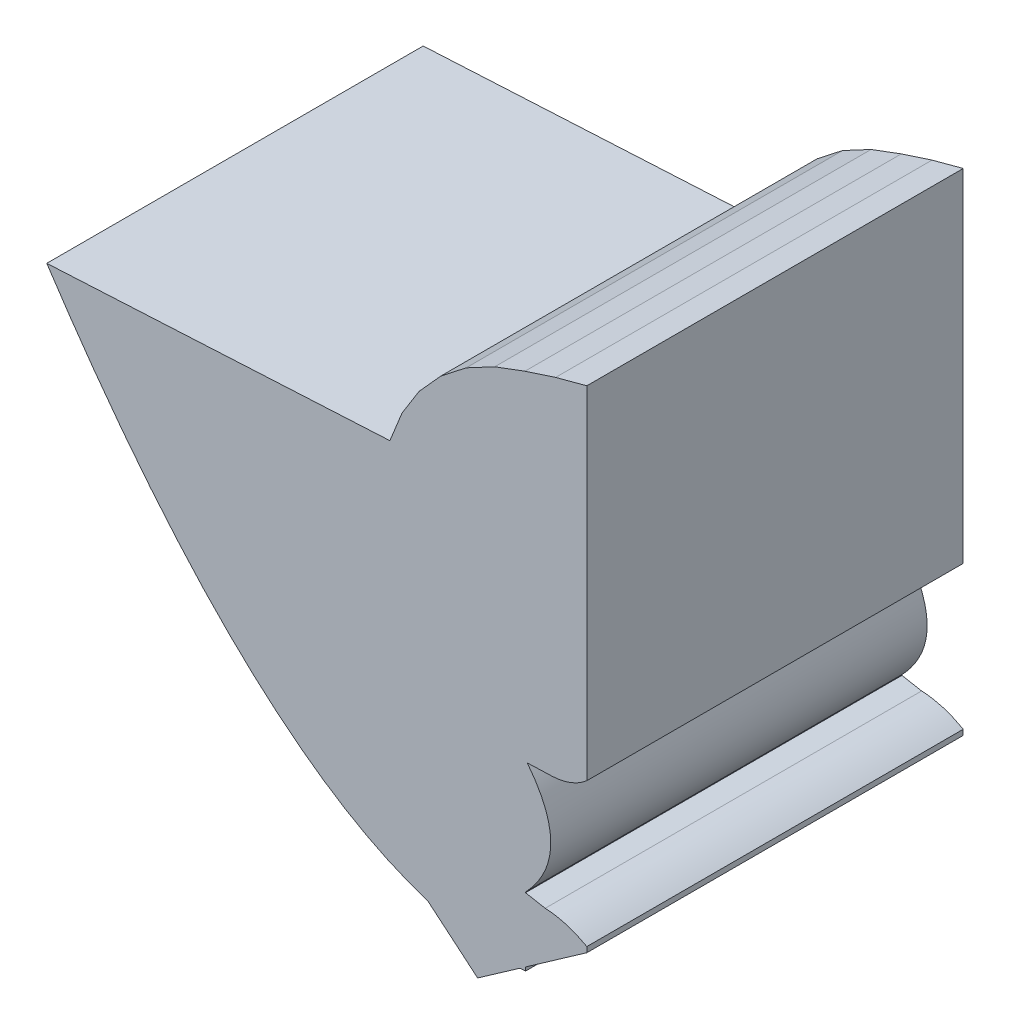
ISO-10303-21;
HEADER;
FILE_DESCRIPTION(('STEP AP214'),'2;1');
FILE_NAME('part.step','',(''),(''),'','','');
FILE_SCHEMA(('AUTOMOTIVE_DESIGN { 1 0 10303 214 1 1 1 1 }'));
ENDSEC;
DATA;
#1=APPLICATION_CONTEXT('core data for automotive mechanical design processes');
#2=APPLICATION_PROTOCOL_DEFINITION('international standard','automotive_design',2000,#1);
#3=PRODUCT_CONTEXT('',#1,'mechanical');
#4=PRODUCT('Part','Part','',(#3));
#5=PRODUCT_RELATED_PRODUCT_CATEGORY('part','',(#4));
#6=PRODUCT_DEFINITION_FORMATION('','',#4);
#7=PRODUCT_DEFINITION_CONTEXT('part definition',#1,'design');
#8=PRODUCT_DEFINITION('design','',#6,#7);
#9=PRODUCT_DEFINITION_SHAPE('','',#8);
#10=(LENGTH_UNIT() NAMED_UNIT(*) SI_UNIT(.MILLI.,.METRE.));
#11=(NAMED_UNIT(*) PLANE_ANGLE_UNIT() SI_UNIT($,.RADIAN.));
#12=(NAMED_UNIT(*) SI_UNIT($,.STERADIAN.) SOLID_ANGLE_UNIT());
#13=UNCERTAINTY_MEASURE_WITH_UNIT(LENGTH_MEASURE(1.E-05),#10,'distance_accuracy_value','');
#14=(GEOMETRIC_REPRESENTATION_CONTEXT(3) GLOBAL_UNCERTAINTY_ASSIGNED_CONTEXT((#13)) GLOBAL_UNIT_ASSIGNED_CONTEXT((#10,
#11,#12)) REPRESENTATION_CONTEXT('',''));
#15=CARTESIAN_POINT('',(0.,0.,0.));
#16=DIRECTION('',(0.,0.,1.));
#17=DIRECTION('',(1.,0.,0.));
#18=AXIS2_PLACEMENT_3D('',#15,#16,#17);
#19=CARTESIAN_POINT('',(-2.17733041778456,0.,6.9937));
#20=DIRECTION('',(1.,0.,0.));
#21=DIRECTION('',(0.,1.,0.));
#22=AXIS2_PLACEMENT_3D('',#19,#20,#21);
#23=PLANE('',#22);
#24=DIRECTION('',(0.,-1.,0.));
#25=VECTOR('',#24,1.);
#26=CARTESIAN_POINT('',(-2.17733041778456,0.,6.9937));
#27=LINE('',#26,#25);
#28=CARTESIAN_POINT('',(-2.17733041778884,-1.84042057231271,6.9937));
#29=VERTEX_POINT('',#28);
#30=CARTESIAN_POINT('',(-2.17733041778456,-1.86563836372951,6.9937));
#31=VERTEX_POINT('',#30);
#32=EDGE_CURVE('E396',#29,#31,#27,.T.);
#33=ORIENTED_EDGE('',*,*,#32,.T.);
#34=DIRECTION('',(0.,0.,-1.));
#35=VECTOR('',#34,1.);
#36=CARTESIAN_POINT('',(-2.17733041778456,-1.86563836372951,6.9937));
#37=LINE('',#36,#35);
#38=CARTESIAN_POINT('',(-2.17733041778456,-1.86563836372951,-6.9937));
#39=VERTEX_POINT('',#38);
#40=EDGE_CURVE('E13',#31,#39,#37,.T.);
#41=ORIENTED_EDGE('',*,*,#40,.T.);
#42=DIRECTION('',(0.,-1.,0.));
#43=VECTOR('',#42,1.);
#44=CARTESIAN_POINT('',(-2.17733041778456,0.,-6.9937));
#45=LINE('',#44,#43);
#46=CARTESIAN_POINT('',(-2.17733041778456,-1.84042057231304,-6.9937));
#47=VERTEX_POINT('',#46);
#48=EDGE_CURVE('E220',#47,#39,#45,.T.);
#49=ORIENTED_EDGE('',*,*,#48,.F.);
#50=DIRECTION('',(0.,0.,-1.));
#51=VECTOR('',#50,1.);
#52=CARTESIAN_POINT('',(-2.17733041778574,-1.84042057231,30.7968303069805));
#53=LINE('',#52,#51);
#54=EDGE_CURVE('E348',#29,#47,#53,.T.);
#55=ORIENTED_EDGE('',*,*,#54,.F.);
#56=EDGE_LOOP('',(#33,#41,#49,#55));
#57=FACE_BOUND('',#56,.T.);
#58=ADVANCED_FACE('F60',(#57),#23,.T.);
#59=CARTESIAN_POINT('',(-2.17733041778456,-4.25341499115567,-6.9937));
#60=VERTEX_POINT('',#59);
#61=CARTESIAN_POINT('',(-2.17733041780011,-4.38828202201252,-6.9937));
#62=VERTEX_POINT('',#61);
#63=EDGE_CURVE('E336',#60,#62,#45,.T.);
#64=ORIENTED_EDGE('',*,*,#63,.F.);
#65=DIRECTION('',(0.,0.,1.));
#66=VECTOR('',#65,1.);
#67=CARTESIAN_POINT('',(-2.17733041778456,-4.25341499115567,6.9937));
#68=LINE('',#67,#66);
#69=CARTESIAN_POINT('',(-2.17733041778456,-4.25341499115567,6.9937));
#70=VERTEX_POINT('',#69);
#71=EDGE_CURVE('E247',#60,#70,#68,.T.);
#72=ORIENTED_EDGE('',*,*,#71,.T.);
#73=CARTESIAN_POINT('',(-2.17733041778456,-4.38828202201252,6.9937));
#74=VERTEX_POINT('',#73);
#75=EDGE_CURVE('E397',#70,#74,#27,.T.);
#76=ORIENTED_EDGE('',*,*,#75,.T.);
#77=DIRECTION('',(0.,0.,1.));
#78=VECTOR('',#77,1.);
#79=CARTESIAN_POINT('',(-2.17733041780011,-4.38828202201252,-6.9937));
#80=LINE('',#79,#78);
#81=EDGE_CURVE('E309',#62,#74,#80,.T.);
#82=ORIENTED_EDGE('',*,*,#81,.F.);
#83=EDGE_LOOP('',(#64,#72,#76,#82));
#84=FACE_BOUND('',#83,.T.);
#85=ADVANCED_FACE('F367',(#84),#23,.T.);
#86=CARTESIAN_POINT('',(-82931.2998220372,996560.090302793,30.7968303069805));
#87=CARTESIAN_POINT('',(87153.689514863,-996199.076380996,30.7968303069805));
#88=CARTESIAN_POINT('',(-91384.2921388703,995820.549302198,30.7968303069805));
#89=B_SPLINE_CURVE_WITH_KNOTS('',2,(#86,#87,#88),.UNSPECIFIED.,.F.,.F.,(3,3),(0.,1.),.UNSPECIFIED.);
#90=DIRECTION('',(0.,0.,-1.));
#91=VECTOR('',#90,1.);
#92=SURFACE_OF_LINEAR_EXTRUSION('',#89,#91);
#93=CARTESIAN_POINT('',(-82931.2998220372,996560.090302793,-6.9937));
#94=CARTESIAN_POINT('',(87153.689514863,-996199.076380996,-6.9937));
#95=CARTESIAN_POINT('',(-91384.2921388703,995820.549302198,-6.9937));
#96=B_SPLINE_CURVE_WITH_KNOTS('',2,(#93,#94,#95),.UNSPECIFIED.,.F.,.F.,(3,3),(0.,1.),.UNSPECIFIED.);
#97=CARTESIAN_POINT('',(-19.9693590135837,9.49376503209609,-6.9937));
#98=VERTEX_POINT('',#97);
#99=CARTESIAN_POINT('',(-5.81761685092486,-3.93929269516321,-6.9937));
#100=VERTEX_POINT('',#99);
#101=EDGE_CURVE('E322',#98,#100,#96,.F.);
#102=ORIENTED_EDGE('',*,*,#101,.T.);
#103=DIRECTION('',(0.,0.,-1.));
#104=VECTOR('',#103,1.);
#105=CARTESIAN_POINT('',(-5.81761685053506,-3.939292695464,0.));
#106=LINE('',#105,#104);
#107=CARTESIAN_POINT('',(-5.81761685092177,-3.93929269516581,6.9937));
#108=VERTEX_POINT('',#107);
#109=EDGE_CURVE('E61',#100,#108,#106,.F.);
#110=ORIENTED_EDGE('',*,*,#109,.T.);
#111=CARTESIAN_POINT('',(-82931.2998220372,996560.090302793,6.9937));
#112=CARTESIAN_POINT('',(87153.689514863,-996199.076380996,6.9937));
#113=CARTESIAN_POINT('',(-91384.2921388703,995820.549302198,6.9937));
#114=B_SPLINE_CURVE_WITH_KNOTS('',2,(#111,#112,#113),.UNSPECIFIED.,.F.,.F.,(3,3),(0.,1.),.UNSPECIFIED.);
#115=CARTESIAN_POINT('',(-19.9693590135837,9.49376503209609,6.9937));
#116=VERTEX_POINT('',#115);
#117=EDGE_CURVE('E339',#108,#116,#114,.T.);
#118=ORIENTED_EDGE('',*,*,#117,.T.);
#119=DIRECTION('',(0.,0.,1.));
#120=VECTOR('',#119,1.);
#121=CARTESIAN_POINT('',(-19.9693590135837,9.49376503209609,-6.9937));
#122=LINE('',#121,#120);
#123=EDGE_CURVE('E307',#98,#116,#122,.T.);
#124=ORIENTED_EDGE('',*,*,#123,.F.);
#125=EDGE_LOOP('',(#102,#110,#118,#124));
#126=FACE_BOUND('',#125,.T.);
#127=ADVANCED_FACE('F364',(#126),#92,.T.);
#128=CARTESIAN_POINT('',(-2.38857363559612,-4.40132908466322,6.9937));
#129=VERTEX_POINT('',#128);
#130=EDGE_CURVE('E330',#74,#129,#114,.T.);
#131=ORIENTED_EDGE('',*,*,#130,.T.);
#132=DIRECTION('',(0.,0.,-1.));
#133=VECTOR('',#132,1.);
#134=CARTESIAN_POINT('',(-2.38857363569212,-4.40132908475959,0.));
#135=LINE('',#134,#133);
#136=CARTESIAN_POINT('',(-2.38857363552891,-4.40132908473014,-6.9937));
#137=VERTEX_POINT('',#136);
#138=EDGE_CURVE('E402',#129,#137,#135,.T.);
#139=ORIENTED_EDGE('',*,*,#138,.T.);
#140=EDGE_CURVE('E318',#137,#62,#96,.F.);
#141=ORIENTED_EDGE('',*,*,#140,.T.);
#142=ORIENTED_EDGE('',*,*,#81,.T.);
#143=EDGE_LOOP('',(#131,#139,#141,#142));
#144=FACE_BOUND('',#143,.T.);
#145=ADVANCED_FACE('F368',(#144),#92,.T.);
#146=CARTESIAN_POINT('',(-996004.99942647,89338.2959789018,30.7968303069805));
#147=CARTESIAN_POINT('',(996193.448091746,-87155.7427476542,30.7968303069805));
#148=CARTESIAN_POINT('',(-996386.896757022,84973.1895164066,30.7968303069805));
#149=B_SPLINE_CURVE_WITH_KNOTS('',2,(#146,#147,#148),.UNSPECIFIED.,.F.,.F.,(3,3),(0.,1.),.UNSPECIFIED.);
#150=DIRECTION('',(0.,0.,-1.));
#151=VECTOR('',#150,1.);
#152=SURFACE_OF_LINEAR_EXTRUSION('',#149,#151);
#153=CARTESIAN_POINT('',(-996004.99942647,89338.2959789018,-6.9937));
#154=CARTESIAN_POINT('',(996193.448091746,-87155.7427476542,-6.9937));
#155=CARTESIAN_POINT('',(-996386.896757022,84973.1895164066,-6.9937));
#156=B_SPLINE_CURVE_WITH_KNOTS('',2,(#153,#154,#155),.UNSPECIFIED.,.F.,.F.,(3,3),(0.,1.),.UNSPECIFIED.);
#157=CARTESIAN_POINT('',(-2.11351559802885,2.3447154697661,-6.9937));
#158=VERTEX_POINT('',#157);
#159=EDGE_CURVE('E312',#47,#158,#156,.F.);
#160=ORIENTED_EDGE('',*,*,#159,.T.);
#161=DIRECTION('',(0.,0.,-1.));
#162=VECTOR('',#161,1.);
#163=CARTESIAN_POINT('',(-2.11351560820955,2.34471546941639,0.));
#164=LINE('',#163,#162);
#165=CARTESIAN_POINT('',(-2.11351559756429,2.34471545593529,6.9937));
#166=VERTEX_POINT('',#165);
#167=EDGE_CURVE('E398',#158,#166,#164,.F.);
#168=ORIENTED_EDGE('',*,*,#167,.T.);
#169=CARTESIAN_POINT('',(-996004.99942647,89338.2959789018,6.9937));
#170=CARTESIAN_POINT('',(996193.448091746,-87155.7427476542,6.9937));
#171=CARTESIAN_POINT('',(-996386.896757022,84973.1895164066,6.9937));
#172=B_SPLINE_CURVE_WITH_KNOTS('',2,(#169,#170,#171),.UNSPECIFIED.,.F.,.F.,(3,3),(0.,1.),.UNSPECIFIED.);
#173=EDGE_CURVE('E328',#166,#29,#172,.T.);
#174=ORIENTED_EDGE('',*,*,#173,.T.);
#175=ORIENTED_EDGE('',*,*,#54,.T.);
#176=EDGE_LOOP('',(#160,#168,#174,#175));
#177=FACE_BOUND('',#176,.T.);
#178=ADVANCED_FACE('F373',(#177),#152,.T.);
#179=CARTESIAN_POINT('',(0.,0.,6.9937));
#180=DIRECTION('',(0.,0.,1.));
#181=DIRECTION('',(1.,0.,0.));
#182=AXIS2_PLACEMENT_3D('',#179,#180,#181);
#183=PLANE('',#182);
#184=ORIENTED_EDGE('',*,*,#75,.F.);
#185=DIRECTION('',(0.819152044288594,0.573576436351615,0.));
#186=VECTOR('',#185,1.);
#187=CARTESIAN_POINT('',(0.100000000004221,-2.65881106562334,6.9937));
#188=LINE('',#187,#186);
#189=CARTESIAN_POINT('',(0.100000000004221,-2.65881106562334,6.9937));
#190=VERTEX_POINT('',#189);
#191=EDGE_CURVE('E71',#70,#190,#188,.T.);
#192=ORIENTED_EDGE('',*,*,#191,.T.);
#193=DIRECTION('',(-1.62011653008151E-11,1.,0.));
#194=VECTOR('',#193,1.);
#195=CARTESIAN_POINT('',(0.100000000000981,-2.45881106562334,6.9937));
#196=LINE('',#195,#194);
#197=CARTESIAN_POINT('',(0.100000000000981,-2.45881106562334,6.9937));
#198=VERTEX_POINT('',#197);
#199=EDGE_CURVE('E257',#190,#198,#196,.T.);
#200=ORIENTED_EDGE('',*,*,#199,.T.);
#201=CARTESIAN_POINT('',(-15004.7897636461,-999892.444646946,6.9937));
#202=CARTESIAN_POINT('',(17450.906437277,999845.695156391,6.9937));
#203=CARTESIAN_POINT('',(-19903.023110908,-999806.945665836,6.9937));
#204=B_SPLINE_CURVE_WITH_KNOTS('',2,(#201,#202,#203),.UNSPECIFIED.,.F.,.F.,(3,3),(0.,1.),.UNSPECIFIED.);
#205=CARTESIAN_POINT('',(-1.44765075676889,-2.00137084805176,6.9937));
#206=VERTEX_POINT('',#205);
#207=EDGE_CURVE('E255',#198,#206,#204,.T.);
#208=ORIENTED_EDGE('',*,*,#207,.T.);
#209=DIRECTION('',(-0.983135348114243,0.182879433748812,0.));
#210=VECTOR('',#209,1.);
#211=CARTESIAN_POINT('',(-1.44765075676889,-2.00137084805176,6.9937));
#212=LINE('',#211,#210);
#213=EDGE_CURVE('E227',#206,#31,#212,.T.);
#214=ORIENTED_EDGE('',*,*,#213,.T.);
#215=ORIENTED_EDGE('',*,*,#32,.F.);
#216=ORIENTED_EDGE('',*,*,#173,.F.);
#217=DIRECTION('',(0.999390827019096,0.0348994967025048,0.));
#218=VECTOR('',#217,1.);
#219=CARTESIAN_POINT('',(-2.17733041778456,2.34248700715526,6.9937));
#220=LINE('',#219,#218);
#221=CARTESIAN_POINT('',(-1.19050164048462,2.37694782742692,6.9937));
#222=VERTEX_POINT('',#221);
#223=EDGE_CURVE('E501',#166,#222,#220,.T.);
#224=ORIENTED_EDGE('',*,*,#223,.T.);
#225=CARTESIAN_POINT('',(-343900.072311573,939011.080499257,6.9937));
#226=CARTESIAN_POINT('',(342019.599581338,-939690.120785908,6.9937));
#227=CARTESIAN_POINT('',(-340141.301828429,940379.16107256,6.9937));
#228=B_SPLINE_CURVE_WITH_KNOTS('',2,(#225,#226,#227),.UNSPECIFIED.,.F.,.F.,(3,3),(0.,1.),.UNSPECIFIED.);
#229=CARTESIAN_POINT('',(0.100000000004221,2.87767341815847,6.9937));
#230=VERTEX_POINT('',#229);
#231=EDGE_CURVE('E306',#222,#230,#228,.T.);
#232=ORIENTED_EDGE('',*,*,#231,.T.);
#233=DIRECTION('',(0.,1.,0.));
#234=VECTOR('',#233,1.);
#235=CARTESIAN_POINT('',(0.100000000004221,2.87767341815847,6.9937));
#236=LINE('',#235,#234);
#237=CARTESIAN_POINT('',(0.100000000004747,15.587903347272,6.9937));
#238=VERTEX_POINT('',#237);
#239=EDGE_CURVE('E433',#230,#238,#236,.T.);
#240=ORIENTED_EDGE('',*,*,#239,.T.);
#241=DIRECTION('',(-0.96592582628907,-0.258819045102515,0.));
#242=VECTOR('',#241,1.);
#243=CARTESIAN_POINT('',(-1.05911099154214,15.277320493149,6.9937));
#244=LINE('',#243,#242);
#245=CARTESIAN_POINT('',(-1.05911099154214,15.277320493149,6.9937));
#246=VERTEX_POINT('',#245);
#247=EDGE_CURVE('E438',#238,#246,#244,.T.);
#248=ORIENTED_EDGE('',*,*,#247,.T.);
#249=DIRECTION('',(-0.951056516295155,-0.309016994374943,0.));
#250=VECTOR('',#249,1.);
#251=CARTESIAN_POINT('',(-2.20037881109632,14.906500099899,6.9937));
#252=LINE('',#251,#250);
#253=CARTESIAN_POINT('',(-2.20037881109632,14.906500099899,6.9937));
#254=VERTEX_POINT('',#253);
#255=EDGE_CURVE('E445',#246,#254,#252,.T.);
#256=ORIENTED_EDGE('',*,*,#255,.T.);
#257=DIRECTION('',(-0.9366721892484,-0.350207381259461,0.));
#258=VECTOR('',#257,1.);
#259=CARTESIAN_POINT('',(-3.3243854381944,14.4862512423877,6.9937));
#260=LINE('',#259,#258);
#261=CARTESIAN_POINT('',(-3.3243854381944,14.4862512423877,6.9937));
#262=VERTEX_POINT('',#261);
#263=EDGE_CURVE('E517',#254,#262,#260,.T.);
#264=ORIENTED_EDGE('',*,*,#263,.T.);
#265=DIRECTION('',(-0.882947592859007,-0.46947156278574,0.));
#266=VECTOR('',#265,1.);
#267=CARTESIAN_POINT('',(-4.38392254962521,13.9228853670448,6.9937));
#268=LINE('',#267,#266);
#269=CARTESIAN_POINT('',(-4.38392254962521,13.9228853670448,6.9937));
#270=VERTEX_POINT('',#269);
#271=EDGE_CURVE('E514',#262,#270,#268,.T.);
#272=ORIENTED_EDGE('',*,*,#271,.T.);
#273=DIRECTION('',(-0.788010753606726,-0.615661475325654,0.));
#274=VECTOR('',#273,1.);
#275=CARTESIAN_POINT('',(-5.32953545395328,13.184091596654,6.9937));
#276=LINE('',#275,#274);
#277=CARTESIAN_POINT('',(-5.32953545395328,13.184091596654,6.9937));
#278=VERTEX_POINT('',#277);
#279=EDGE_CURVE('E509',#270,#278,#276,.T.);
#280=ORIENTED_EDGE('',*,*,#279,.T.);
#281=DIRECTION('',(-0.669130606358526,-0.743144825477694,0.));
#282=VECTOR('',#281,1.);
#283=CARTESIAN_POINT('',(-6.13249218158351,12.2923178060808,6.9937));
#284=LINE('',#283,#282);
#285=CARTESIAN_POINT('',(-6.13249218158351,12.2923178060808,6.9937));
#286=VERTEX_POINT('',#285);
#287=EDGE_CURVE('E507',#278,#286,#284,.T.);
#288=ORIENTED_EDGE('',*,*,#287,.T.);
#289=DIRECTION('',(-0.52991926423321,-0.848048096156423,0.));
#290=VECTOR('',#289,1.);
#291=CARTESIAN_POINT('',(-6.76839529866336,11.2746600906931,6.9937));
#292=LINE('',#291,#290);
#293=CARTESIAN_POINT('',(-6.76839529866336,11.2746600906931,6.9937));
#294=VERTEX_POINT('',#293);
#295=EDGE_CURVE('E461',#286,#294,#292,.T.);
#296=ORIENTED_EDGE('',*,*,#295,.T.);
#297=DIRECTION('',(-0.374606593415918,-0.927183854566785,0.));
#298=VECTOR('',#297,1.);
#299=CARTESIAN_POINT('',(-7.21792321076246,10.1620394652129,6.9937));
#300=LINE('',#299,#298);
#301=CARTESIAN_POINT('',(-7.21792321076246,10.1620394652129,6.9937));
#302=VERTEX_POINT('',#301);
#303=EDGE_CURVE('E411',#294,#302,#300,.T.);
#304=ORIENTED_EDGE('',*,*,#303,.T.);
#305=DIRECTION('',(-0.998629534754487,-0.0523359562445909,0.));
#306=VECTOR('',#305,1.);
#307=CARTESIAN_POINT('',(-19.9693590135837,9.49376503209609,6.9937));
#308=LINE('',#307,#306);
#309=EDGE_CURVE('E299',#302,#116,#308,.T.);
#310=ORIENTED_EDGE('',*,*,#309,.T.);
#311=ORIENTED_EDGE('',*,*,#117,.F.);
#312=DIRECTION('',(0.766044443118984,-0.642787609686532,0.));
#313=VECTOR('',#312,1.);
#314=CARTESIAN_POINT('',(-10.029650264515,-0.404977011313413,6.9937));
#315=LINE('',#314,#313);
#316=CARTESIAN_POINT('',(-3.95763831339756,-5.5,6.9937));
#317=VERTEX_POINT('',#316);
#318=EDGE_CURVE('E248',#108,#317,#315,.T.);
#319=ORIENTED_EDGE('',*,*,#318,.T.);
#320=EDGE_CURVE('E244',#317,#129,#188,.T.);
#321=ORIENTED_EDGE('',*,*,#320,.T.);
#322=ORIENTED_EDGE('',*,*,#130,.F.);
#323=EDGE_LOOP('',(#184,#192,#200,#208,#214,#215,#216,#224,#232,#240,#248,#256,#264,#272,#280,
#288,#296,#304,#310,#311,#319,#321,#322));
#324=FACE_BOUND('',#323,.T.);
#325=ADVANCED_FACE('F376',(#324),#183,.T.);
#326=CARTESIAN_POINT('',(0.,0.,-6.9937));
#327=DIRECTION('',(0.,0.,1.));
#328=DIRECTION('',(1.,0.,0.));
#329=AXIS2_PLACEMENT_3D('',#326,#327,#328);
#330=PLANE('',#329);
#331=ORIENTED_EDGE('',*,*,#48,.T.);
#332=DIRECTION('',(0.983135348114243,-0.182879433748812,0.));
#333=VECTOR('',#332,1.);
#334=CARTESIAN_POINT('',(-1.44765075676889,-2.00137084805176,-6.9937));
#335=LINE('',#334,#333);
#336=CARTESIAN_POINT('',(-1.44765075676889,-2.00137084805176,-6.9937));
#337=VERTEX_POINT('',#336);
#338=EDGE_CURVE('E212',#39,#337,#335,.T.);
#339=ORIENTED_EDGE('',*,*,#338,.T.);
#340=CARTESIAN_POINT('',(-15004.7897636461,-999892.444646946,-6.9937));
#341=CARTESIAN_POINT('',(17450.906437277,999845.695156391,-6.9937));
#342=CARTESIAN_POINT('',(-19903.023110908,-999806.945665836,-6.9937));
#343=B_SPLINE_CURVE_WITH_KNOTS('',2,(#340,#341,#342),.UNSPECIFIED.,.F.,.F.,(3,3),(0.,1.),.UNSPECIFIED.);
#344=CARTESIAN_POINT('',(0.100000000000981,-2.45881106562334,-6.9937));
#345=VERTEX_POINT('',#344);
#346=EDGE_CURVE('E218',#337,#345,#343,.F.);
#347=ORIENTED_EDGE('',*,*,#346,.T.);
#348=DIRECTION('',(1.62011653008151E-11,-1.,0.));
#349=VECTOR('',#348,1.);
#350=CARTESIAN_POINT('',(0.100000000000981,-2.45881106562334,-6.9937));
#351=LINE('',#350,#349);
#352=CARTESIAN_POINT('',(0.100000000004221,-2.65881106562334,-6.9937));
#353=VERTEX_POINT('',#352);
#354=EDGE_CURVE('E234',#345,#353,#351,.T.);
#355=ORIENTED_EDGE('',*,*,#354,.T.);
#356=DIRECTION('',(-0.819152044288594,-0.573576436351615,0.));
#357=VECTOR('',#356,1.);
#358=CARTESIAN_POINT('',(0.100000000004221,-2.65881106562334,-6.9937));
#359=LINE('',#358,#357);
#360=EDGE_CURVE('E236',#353,#60,#359,.T.);
#361=ORIENTED_EDGE('',*,*,#360,.T.);
#362=ORIENTED_EDGE('',*,*,#63,.T.);
#363=ORIENTED_EDGE('',*,*,#140,.F.);
#364=CARTESIAN_POINT('',(-3.95763831339756,-5.5,-6.9937));
#365=VERTEX_POINT('',#364);
#366=EDGE_CURVE('E79',#137,#365,#359,.T.);
#367=ORIENTED_EDGE('',*,*,#366,.T.);
#368=DIRECTION('',(-0.766044443118984,0.642787609686532,0.));
#369=VECTOR('',#368,1.);
#370=CARTESIAN_POINT('',(-10.029650264515,-0.404977011313413,-6.9937));
#371=LINE('',#370,#369);
#372=EDGE_CURVE('E709',#365,#100,#371,.T.);
#373=ORIENTED_EDGE('',*,*,#372,.T.);
#374=ORIENTED_EDGE('',*,*,#101,.F.);
#375=DIRECTION('',(-0.998629534754487,-0.0523359562445909,0.));
#376=VECTOR('',#375,1.);
#377=CARTESIAN_POINT('',(-19.9693590135837,9.49376503209609,-6.9937));
#378=LINE('',#377,#376);
#379=CARTESIAN_POINT('',(-7.21792321076246,10.1620394652129,-6.9937));
#380=VERTEX_POINT('',#379);
#381=EDGE_CURVE('E304',#380,#98,#378,.T.);
#382=ORIENTED_EDGE('',*,*,#381,.F.);
#383=DIRECTION('',(0.374606593415918,0.927183854566785,0.));
#384=VECTOR('',#383,1.);
#385=CARTESIAN_POINT('',(-7.21792321076246,10.1620394652129,-6.9937));
#386=LINE('',#385,#384);
#387=CARTESIAN_POINT('',(-6.76839529866336,11.2746600906931,-6.9937));
#388=VERTEX_POINT('',#387);
#389=EDGE_CURVE('E425',#380,#388,#386,.T.);
#390=ORIENTED_EDGE('',*,*,#389,.T.);
#391=DIRECTION('',(0.52991926423321,0.848048096156423,0.));
#392=VECTOR('',#391,1.);
#393=CARTESIAN_POINT('',(-6.76839529866336,11.2746600906931,-6.9937));
#394=LINE('',#393,#392);
#395=CARTESIAN_POINT('',(-6.13249218158351,12.2923178060808,-6.9937));
#396=VERTEX_POINT('',#395);
#397=EDGE_CURVE('E460',#388,#396,#394,.T.);
#398=ORIENTED_EDGE('',*,*,#397,.T.);
#399=DIRECTION('',(0.669130606358526,0.743144825477694,0.));
#400=VECTOR('',#399,1.);
#401=CARTESIAN_POINT('',(-6.13249218158351,12.2923178060808,-6.9937));
#402=LINE('',#401,#400);
#403=CARTESIAN_POINT('',(-5.32953545395328,13.184091596654,-6.9937));
#404=VERTEX_POINT('',#403);
#405=EDGE_CURVE('E470',#396,#404,#402,.T.);
#406=ORIENTED_EDGE('',*,*,#405,.T.);
#407=DIRECTION('',(0.788010753606726,0.615661475325654,0.));
#408=VECTOR('',#407,1.);
#409=CARTESIAN_POINT('',(-5.32953545395328,13.184091596654,-6.9937));
#410=LINE('',#409,#408);
#411=CARTESIAN_POINT('',(-4.38392254962521,13.9228853670448,-6.9937));
#412=VERTEX_POINT('',#411);
#413=EDGE_CURVE('E474',#404,#412,#410,.T.);
#414=ORIENTED_EDGE('',*,*,#413,.T.);
#415=DIRECTION('',(0.882947592859007,0.46947156278574,0.));
#416=VECTOR('',#415,1.);
#417=CARTESIAN_POINT('',(-4.38392254962521,13.9228853670448,-6.9937));
#418=LINE('',#417,#416);
#419=CARTESIAN_POINT('',(-3.3243854381944,14.4862512423877,-6.9937));
#420=VERTEX_POINT('',#419);
#421=EDGE_CURVE('E471',#412,#420,#418,.T.);
#422=ORIENTED_EDGE('',*,*,#421,.T.);
#423=DIRECTION('',(0.9366721892484,0.350207381259461,0.));
#424=VECTOR('',#423,1.);
#425=CARTESIAN_POINT('',(-3.3243854381944,14.4862512423877,-6.9937));
#426=LINE('',#425,#424);
#427=CARTESIAN_POINT('',(-2.20037881109632,14.906500099899,-6.9937));
#428=VERTEX_POINT('',#427);
#429=EDGE_CURVE('E711',#420,#428,#426,.T.);
#430=ORIENTED_EDGE('',*,*,#429,.T.);
#431=DIRECTION('',(0.951056516295155,0.309016994374943,0.));
#432=VECTOR('',#431,1.);
#433=CARTESIAN_POINT('',(-2.20037881109632,14.906500099899,-6.9937));
#434=LINE('',#433,#432);
#435=CARTESIAN_POINT('',(-1.05911099154214,15.277320493149,-6.9937));
#436=VERTEX_POINT('',#435);
#437=EDGE_CURVE('E492',#428,#436,#434,.T.);
#438=ORIENTED_EDGE('',*,*,#437,.T.);
#439=DIRECTION('',(0.96592582628907,0.258819045102515,0.));
#440=VECTOR('',#439,1.);
#441=CARTESIAN_POINT('',(-1.05911099154214,15.277320493149,-6.9937));
#442=LINE('',#441,#440);
#443=CARTESIAN_POINT('',(0.100000000004747,15.587903347272,-6.9937));
#444=VERTEX_POINT('',#443);
#445=EDGE_CURVE('E495',#436,#444,#442,.T.);
#446=ORIENTED_EDGE('',*,*,#445,.T.);
#447=DIRECTION('',(0.,-1.,0.));
#448=VECTOR('',#447,1.);
#449=CARTESIAN_POINT('',(0.100000000004221,2.87767341815847,-6.9937));
#450=LINE('',#449,#448);
#451=CARTESIAN_POINT('',(0.0999999999995449,2.8776734181557,-6.9937));
#452=VERTEX_POINT('',#451);
#453=EDGE_CURVE('E487',#444,#452,#450,.T.);
#454=ORIENTED_EDGE('',*,*,#453,.T.);
#455=CARTESIAN_POINT('',(-343900.072311573,939011.080499257,-6.9937));
#456=CARTESIAN_POINT('',(342019.599581338,-939690.120785908,-6.9937));
#457=CARTESIAN_POINT('',(-340141.301828429,940379.16107256,-6.9937));
#458=B_SPLINE_CURVE_WITH_KNOTS('',2,(#455,#456,#457),.UNSPECIFIED.,.F.,.F.,(3,3),(0.,1.),.UNSPECIFIED.);
#459=CARTESIAN_POINT('',(-1.19050164048462,2.37694782741517,-6.9937));
#460=VERTEX_POINT('',#459);
#461=EDGE_CURVE('E485',#452,#460,#458,.F.);
#462=ORIENTED_EDGE('',*,*,#461,.T.);
#463=DIRECTION('',(-0.999390827019096,-0.0348994967025048,0.));
#464=VECTOR('',#463,1.);
#465=CARTESIAN_POINT('',(-2.17733041778456,2.34248700715526,-6.9937));
#466=LINE('',#465,#464);
#467=EDGE_CURVE('E480',#460,#158,#466,.T.);
#468=ORIENTED_EDGE('',*,*,#467,.T.);
#469=ORIENTED_EDGE('',*,*,#159,.F.);
#470=EDGE_LOOP('',(#331,#339,#347,#355,#361,#362,#363,#367,#373,#374,#382,#390,#398,#406,#414,
#422,#430,#438,#446,#454,#462,#468,#469));
#471=FACE_BOUND('',#470,.T.);
#472=ADVANCED_FACE('F215',(#471),#330,.F.);
#473=CARTESIAN_POINT('',(-19.9693590135837,9.49376503209609,-6.9937));
#474=DIRECTION('',(-0.0523359562445909,0.998629534754487,0.));
#475=DIRECTION('',(-0.998629534754488,-0.052335956244591,0.));
#476=AXIS2_PLACEMENT_3D('',#473,#474,#475);
#477=PLANE('',#476);
#478=ORIENTED_EDGE('',*,*,#309,.F.);
#479=DIRECTION('',(0.,0.,-1.));
#480=VECTOR('',#479,1.);
#481=CARTESIAN_POINT('',(-7.21792321076246,10.1620394652129,23.8402253000013));
#482=LINE('',#481,#480);
#483=EDGE_CURVE('E419',#302,#380,#482,.T.);
#484=ORIENTED_EDGE('',*,*,#483,.T.);
#485=ORIENTED_EDGE('',*,*,#381,.T.);
#486=ORIENTED_EDGE('',*,*,#123,.T.);
#487=EDGE_LOOP('',(#478,#484,#485,#486));
#488=FACE_BOUND('',#487,.T.);
#489=ADVANCED_FACE('F371',(#488),#477,.T.);
#490=CARTESIAN_POINT('',(-1.05911099154214,15.277320493149,23.8402253000013));
#491=DIRECTION('',(0.258819045102515,-0.96592582628907,0.));
#492=DIRECTION('',(0.96592582628907,0.258819045102515,0.));
#493=AXIS2_PLACEMENT_3D('',#490,#491,#492);
#494=PLANE('',#493);
#495=ORIENTED_EDGE('',*,*,#247,.F.);
#496=DIRECTION('',(0.,0.,-1.));
#497=VECTOR('',#496,1.);
#498=CARTESIAN_POINT('',(0.100000000004747,15.587903347272,23.8402253000013));
#499=LINE('',#498,#497);
#500=EDGE_CURVE('E300',#238,#444,#499,.T.);
#501=ORIENTED_EDGE('',*,*,#500,.T.);
#502=ORIENTED_EDGE('',*,*,#445,.F.);
#503=DIRECTION('',(0.,0.,-1.));
#504=VECTOR('',#503,1.);
#505=CARTESIAN_POINT('',(-1.05911099154214,15.277320493149,23.8402253000013));
#506=LINE('',#505,#504);
#507=EDGE_CURVE('E447',#246,#436,#506,.T.);
#508=ORIENTED_EDGE('',*,*,#507,.F.);
#509=EDGE_LOOP('',(#495,#501,#502,#508));
#510=FACE_BOUND('',#509,.T.);
#511=ADVANCED_FACE('F383',(#510),#494,.F.);
#512=CARTESIAN_POINT('',(-2.20037881109632,14.906500099899,23.8402253000013));
#513=DIRECTION('',(0.309016994374943,-0.951056516295155,0.));
#514=DIRECTION('',(0.951056516295155,0.309016994374943,0.));
#515=AXIS2_PLACEMENT_3D('',#512,#513,#514);
#516=PLANE('',#515);
#517=ORIENTED_EDGE('',*,*,#255,.F.);
#518=ORIENTED_EDGE('',*,*,#507,.T.);
#519=ORIENTED_EDGE('',*,*,#437,.F.);
#520=DIRECTION('',(0.,0.,-1.));
#521=VECTOR('',#520,1.);
#522=CARTESIAN_POINT('',(-2.20037881109632,14.906500099899,23.8402253000013));
#523=LINE('',#522,#521);
#524=EDGE_CURVE('E449',#254,#428,#523,.T.);
#525=ORIENTED_EDGE('',*,*,#524,.F.);
#526=EDGE_LOOP('',(#517,#518,#519,#525));
#527=FACE_BOUND('',#526,.T.);
#528=ADVANCED_FACE('F524',(#527),#516,.F.);
#529=CARTESIAN_POINT('',(-3.3243854381944,14.4862512423877,23.8402253000013));
#530=DIRECTION('',(0.350207381259461,-0.9366721892484,0.));
#531=DIRECTION('',(0.9366721892484,0.350207381259461,0.));
#532=AXIS2_PLACEMENT_3D('',#529,#530,#531);
#533=PLANE('',#532);
#534=ORIENTED_EDGE('',*,*,#263,.F.);
#535=ORIENTED_EDGE('',*,*,#524,.T.);
#536=ORIENTED_EDGE('',*,*,#429,.F.);
#537=DIRECTION('',(0.,0.,-1.));
#538=VECTOR('',#537,1.);
#539=CARTESIAN_POINT('',(-3.3243854381944,14.4862512423877,23.8402253000013));
#540=LINE('',#539,#538);
#541=EDGE_CURVE('E448',#262,#420,#540,.T.);
#542=ORIENTED_EDGE('',*,*,#541,.F.);
#543=EDGE_LOOP('',(#534,#535,#536,#542));
#544=FACE_BOUND('',#543,.T.);
#545=ADVANCED_FACE('F553',(#544),#533,.F.);
#546=CARTESIAN_POINT('',(-4.38392254962521,13.9228853670448,23.8402253000013));
#547=DIRECTION('',(0.46947156278574,-0.882947592859007,0.));
#548=DIRECTION('',(0.882947592859007,0.46947156278574,0.));
#549=AXIS2_PLACEMENT_3D('',#546,#547,#548);
#550=PLANE('',#549);
#551=ORIENTED_EDGE('',*,*,#271,.F.);
#552=ORIENTED_EDGE('',*,*,#541,.T.);
#553=ORIENTED_EDGE('',*,*,#421,.F.);
#554=DIRECTION('',(0.,0.,-1.));
#555=VECTOR('',#554,1.);
#556=CARTESIAN_POINT('',(-4.38392254962521,13.9228853670448,23.8402253000013));
#557=LINE('',#556,#555);
#558=EDGE_CURVE('E454',#270,#412,#557,.T.);
#559=ORIENTED_EDGE('',*,*,#558,.F.);
#560=EDGE_LOOP('',(#551,#552,#553,#559));
#561=FACE_BOUND('',#560,.T.);
#562=ADVANCED_FACE('F550',(#561),#550,.F.);
#563=CARTESIAN_POINT('',(-5.32953545395328,13.184091596654,23.8402253000013));
#564=DIRECTION('',(0.615661475325654,-0.788010753606726,0.));
#565=DIRECTION('',(0.788010753606726,0.615661475325654,0.));
#566=AXIS2_PLACEMENT_3D('',#563,#564,#565);
#567=PLANE('',#566);
#568=ORIENTED_EDGE('',*,*,#279,.F.);
#569=ORIENTED_EDGE('',*,*,#558,.T.);
#570=ORIENTED_EDGE('',*,*,#413,.F.);
#571=DIRECTION('',(0.,0.,-1.));
#572=VECTOR('',#571,1.);
#573=CARTESIAN_POINT('',(-5.32953545395328,13.184091596654,23.8402253000013));
#574=LINE('',#573,#572);
#575=EDGE_CURVE('E451',#278,#404,#574,.T.);
#576=ORIENTED_EDGE('',*,*,#575,.F.);
#577=EDGE_LOOP('',(#568,#569,#570,#576));
#578=FACE_BOUND('',#577,.T.);
#579=ADVANCED_FACE('F545',(#578),#567,.F.);
#580=CARTESIAN_POINT('',(-6.13249218158351,12.2923178060808,23.8402253000013));
#581=DIRECTION('',(0.743144825477694,-0.669130606358526,0.));
#582=DIRECTION('',(0.669130606358526,0.743144825477694,0.));
#583=AXIS2_PLACEMENT_3D('',#580,#581,#582);
#584=PLANE('',#583);
#585=ORIENTED_EDGE('',*,*,#287,.F.);
#586=ORIENTED_EDGE('',*,*,#575,.T.);
#587=ORIENTED_EDGE('',*,*,#405,.F.);
#588=DIRECTION('',(0.,0.,-1.));
#589=VECTOR('',#588,1.);
#590=CARTESIAN_POINT('',(-6.13249218158351,12.2923178060808,23.8402253000013));
#591=LINE('',#590,#589);
#592=EDGE_CURVE('E427',#286,#396,#591,.T.);
#593=ORIENTED_EDGE('',*,*,#592,.F.);
#594=EDGE_LOOP('',(#585,#586,#587,#593));
#595=FACE_BOUND('',#594,.T.);
#596=ADVANCED_FACE('F468',(#595),#584,.F.);
#597=CARTESIAN_POINT('',(-6.76839529866336,11.2746600906931,23.8402253000013));
#598=DIRECTION('',(0.848048096156423,-0.529919264233209,0.));
#599=DIRECTION('',(0.52991926423321,0.848048096156423,0.));
#600=AXIS2_PLACEMENT_3D('',#597,#598,#599);
#601=PLANE('',#600);
#602=ORIENTED_EDGE('',*,*,#295,.F.);
#603=ORIENTED_EDGE('',*,*,#592,.T.);
#604=ORIENTED_EDGE('',*,*,#397,.F.);
#605=DIRECTION('',(0.,0.,-1.));
#606=VECTOR('',#605,1.);
#607=CARTESIAN_POINT('',(-6.76839529866336,11.2746600906931,23.8402253000013));
#608=LINE('',#607,#606);
#609=EDGE_CURVE('E428',#294,#388,#608,.T.);
#610=ORIENTED_EDGE('',*,*,#609,.F.);
#611=EDGE_LOOP('',(#602,#603,#604,#610));
#612=FACE_BOUND('',#611,.T.);
#613=ADVANCED_FACE('F458',(#612),#601,.F.);
#614=CARTESIAN_POINT('',(-7.21792321076246,10.1620394652129,23.8402253000013));
#615=DIRECTION('',(0.927183854566785,-0.374606593415918,0.));
#616=DIRECTION('',(0.374606593415918,0.927183854566785,0.));
#617=AXIS2_PLACEMENT_3D('',#614,#615,#616);
#618=PLANE('',#617);
#619=ORIENTED_EDGE('',*,*,#303,.F.);
#620=ORIENTED_EDGE('',*,*,#609,.T.);
#621=ORIENTED_EDGE('',*,*,#389,.F.);
#622=ORIENTED_EDGE('',*,*,#483,.F.);
#623=EDGE_LOOP('',(#619,#620,#621,#622));
#624=FACE_BOUND('',#623,.T.);
#625=ADVANCED_FACE('F423',(#624),#618,.F.);
#626=CARTESIAN_POINT('',(-2.17733041778456,2.34248700715526,23.8402253000013));
#627=DIRECTION('',(-0.0348994967025048,0.999390827019096,0.));
#628=DIRECTION('',(-0.999390827019096,-0.0348994967025048,0.));
#629=AXIS2_PLACEMENT_3D('',#626,#627,#628);
#630=PLANE('',#629);
#631=ORIENTED_EDGE('',*,*,#167,.F.);
#632=ORIENTED_EDGE('',*,*,#467,.F.);
#633=DIRECTION('',(0.,0.,-1.));
#634=VECTOR('',#633,1.);
#635=CARTESIAN_POINT('',(-1.19050164048462,2.37694782742692,23.8402253000013));
#636=LINE('',#635,#634);
#637=EDGE_CURVE('E424',#222,#460,#636,.T.);
#638=ORIENTED_EDGE('',*,*,#637,.F.);
#639=ORIENTED_EDGE('',*,*,#223,.F.);
#640=EDGE_LOOP('',(#631,#632,#638,#639));
#641=FACE_BOUND('',#640,.T.);
#642=ADVANCED_FACE('F286',(#641),#630,.F.);
#643=CARTESIAN_POINT('',(-343900.072311573,939011.080499257,23.8402253000013));
#644=CARTESIAN_POINT('',(342019.599581338,-939690.120785908,23.8402253000013));
#645=CARTESIAN_POINT('',(-340141.301828429,940379.16107256,23.8402253000013));
#646=B_SPLINE_CURVE_WITH_KNOTS('',2,(#643,#644,#645),.UNSPECIFIED.,.F.,.F.,(3,3),(0.,1.),.UNSPECIFIED.);
#647=DIRECTION('',(0.,0.,-1.));
#648=VECTOR('',#647,1.);
#649=SURFACE_OF_LINEAR_EXTRUSION('',#646,#648);
#650=ORIENTED_EDGE('',*,*,#231,.F.);
#651=ORIENTED_EDGE('',*,*,#637,.T.);
#652=ORIENTED_EDGE('',*,*,#461,.F.);
#653=DIRECTION('',(0.,0.,-1.));
#654=VECTOR('',#653,1.);
#655=CARTESIAN_POINT('',(0.100000000004221,2.87767341815847,23.8402253000013));
#656=LINE('',#655,#654);
#657=EDGE_CURVE('E426',#230,#452,#656,.T.);
#658=ORIENTED_EDGE('',*,*,#657,.F.);
#659=EDGE_LOOP('',(#650,#651,#652,#658));
#660=FACE_BOUND('',#659,.T.);
#661=ADVANCED_FACE('F285',(#660),#649,.F.);
#662=CARTESIAN_POINT('',(0.100000000004221,2.87767341815847,23.8402253000013));
#663=DIRECTION('',(-1.,0.,0.));
#664=DIRECTION('',(0.,-1.,0.));
#665=AXIS2_PLACEMENT_3D('',#662,#663,#664);
#666=PLANE('',#665);
#667=ORIENTED_EDGE('',*,*,#239,.F.);
#668=ORIENTED_EDGE('',*,*,#657,.T.);
#669=ORIENTED_EDGE('',*,*,#453,.F.);
#670=ORIENTED_EDGE('',*,*,#500,.F.);
#671=EDGE_LOOP('',(#667,#668,#669,#670));
#672=FACE_BOUND('',#671,.T.);
#673=ADVANCED_FACE('F278',(#672),#666,.F.);
#674=CARTESIAN_POINT('',(0.100000000004221,-2.65881106562334,18.332530351351));
#675=DIRECTION('',(-0.573576436351615,0.819152044288594,0.));
#676=DIRECTION('',(-0.819152044288594,-0.573576436351615,0.));
#677=AXIS2_PLACEMENT_3D('',#674,#675,#676);
#678=PLANE('',#677);
#679=ORIENTED_EDGE('',*,*,#138,.F.);
#680=ORIENTED_EDGE('',*,*,#320,.F.);
#681=DIRECTION('',(0.,0.,-1.));
#682=VECTOR('',#681,1.);
#683=CARTESIAN_POINT('',(-3.95763831339756,-5.5,18.332530351351));
#684=LINE('',#683,#682);
#685=EDGE_CURVE('E233',#317,#365,#684,.T.);
#686=ORIENTED_EDGE('',*,*,#685,.T.);
#687=ORIENTED_EDGE('',*,*,#366,.F.);
#688=EDGE_LOOP('',(#679,#680,#686,#687));
#689=FACE_BOUND('',#688,.T.);
#690=ADVANCED_FACE('F282',(#689),#678,.F.);
#691=CARTESIAN_POINT('',(-10.029650264515,-0.404977011313413,18.332530351351));
#692=DIRECTION('',(0.642787609686532,0.766044443118984,0.));
#693=DIRECTION('',(-0.766044443118984,0.642787609686532,0.));
#694=AXIS2_PLACEMENT_3D('',#691,#692,#693);
#695=PLANE('',#694);
#696=ORIENTED_EDGE('',*,*,#109,.F.);
#697=ORIENTED_EDGE('',*,*,#372,.F.);
#698=ORIENTED_EDGE('',*,*,#685,.F.);
#699=ORIENTED_EDGE('',*,*,#318,.F.);
#700=EDGE_LOOP('',(#696,#697,#698,#699));
#701=FACE_BOUND('',#700,.T.);
#702=ADVANCED_FACE('F661',(#701),#695,.F.);
#703=ORIENTED_EDGE('',*,*,#71,.F.);
#704=ORIENTED_EDGE('',*,*,#360,.F.);
#705=DIRECTION('',(0.,0.,-1.));
#706=VECTOR('',#705,1.);
#707=CARTESIAN_POINT('',(0.100000000004221,-2.65881106562334,18.332530351351));
#708=LINE('',#707,#706);
#709=EDGE_CURVE('E261',#190,#353,#708,.T.);
#710=ORIENTED_EDGE('',*,*,#709,.F.);
#711=ORIENTED_EDGE('',*,*,#191,.F.);
#712=EDGE_LOOP('',(#703,#704,#710,#711));
#713=FACE_BOUND('',#712,.T.);
#714=ADVANCED_FACE('F280',(#713),#678,.F.);
#715=CARTESIAN_POINT('',(-15004.7897636461,-999892.444646946,18.332530351351));
#716=CARTESIAN_POINT('',(17450.906437277,999845.695156391,18.332530351351));
#717=CARTESIAN_POINT('',(-19903.023110908,-999806.945665836,18.332530351351));
#718=B_SPLINE_CURVE_WITH_KNOTS('',2,(#715,#716,#717),.UNSPECIFIED.,.F.,.F.,(3,3),(0.,1.),.UNSPECIFIED.);
#719=DIRECTION('',(0.,0.,-1.));
#720=VECTOR('',#719,1.);
#721=SURFACE_OF_LINEAR_EXTRUSION('',#718,#720);
#722=ORIENTED_EDGE('',*,*,#207,.F.);
#723=DIRECTION('',(0.,0.,-1.));
#724=VECTOR('',#723,1.);
#725=CARTESIAN_POINT('',(0.100000000000981,-2.45881106562334,18.332530351351));
#726=LINE('',#725,#724);
#727=EDGE_CURVE('E222',#198,#345,#726,.T.);
#728=ORIENTED_EDGE('',*,*,#727,.T.);
#729=ORIENTED_EDGE('',*,*,#346,.F.);
#730=DIRECTION('',(0.,0.,-1.));
#731=VECTOR('',#730,1.);
#732=CARTESIAN_POINT('',(-1.44765075676889,-2.00137084805176,18.332530351351));
#733=LINE('',#732,#731);
#734=EDGE_CURVE('E221',#206,#337,#733,.T.);
#735=ORIENTED_EDGE('',*,*,#734,.F.);
#736=EDGE_LOOP('',(#722,#728,#729,#735));
#737=FACE_BOUND('',#736,.T.);
#738=ADVANCED_FACE('F231',(#737),#721,.F.);
#739=CARTESIAN_POINT('',(-1.44765075676889,-2.00137084805176,18.332530351351));
#740=DIRECTION('',(-0.182879433748812,-0.983135348114243,0.));
#741=DIRECTION('',(0.983135348114243,-0.182879433748812,0.));
#742=AXIS2_PLACEMENT_3D('',#739,#740,#741);
#743=PLANE('',#742);
#744=ORIENTED_EDGE('',*,*,#40,.F.);
#745=ORIENTED_EDGE('',*,*,#213,.F.);
#746=ORIENTED_EDGE('',*,*,#734,.T.);
#747=ORIENTED_EDGE('',*,*,#338,.F.);
#748=EDGE_LOOP('',(#744,#745,#746,#747));
#749=FACE_BOUND('',#748,.T.);
#750=ADVANCED_FACE('F223',(#749),#743,.F.);
#751=CARTESIAN_POINT('',(0.100000000000981,-2.45881106562334,18.332530351351));
#752=DIRECTION('',(-1.,-1.62011653008151E-11,0.));
#753=DIRECTION('',(1.62011653008151E-11,-1.,0.));
#754=AXIS2_PLACEMENT_3D('',#751,#752,#753);
#755=PLANE('',#754);
#756=ORIENTED_EDGE('',*,*,#199,.F.);
#757=ORIENTED_EDGE('',*,*,#709,.T.);
#758=ORIENTED_EDGE('',*,*,#354,.F.);
#759=ORIENTED_EDGE('',*,*,#727,.F.);
#760=EDGE_LOOP('',(#756,#757,#758,#759));
#761=FACE_BOUND('',#760,.T.);
#762=ADVANCED_FACE('F695',(#761),#755,.F.);
#763=CLOSED_SHELL('',(#58,#85,#127,#145,#178,#325,#472,#489,#511,#528,#545,#562,#579,#596,#613,
#625,#642,#661,#673,#690,#702,#714,#738,#750,#762));
#764=MANIFOLD_SOLID_BREP('B2',#763);
#765=ADVANCED_BREP_SHAPE_REPRESENTATION('',(#18,#764),#14);
#766=SHAPE_DEFINITION_REPRESENTATION(#9,#765);
ENDSEC;
END-ISO-10303-21;
